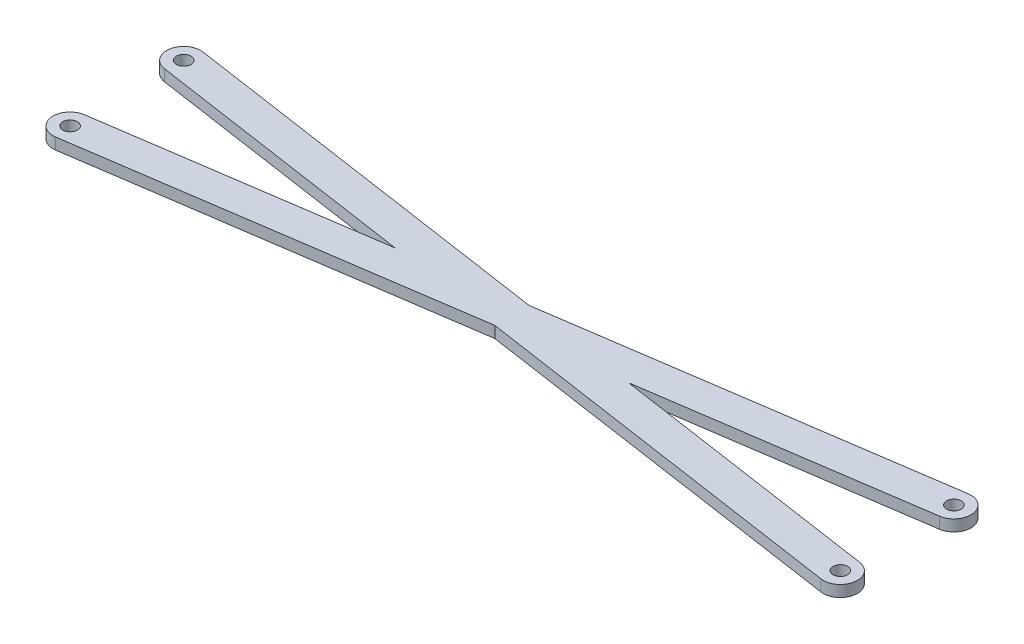
ISO-10303-21;
HEADER;
FILE_DESCRIPTION(('STEP AP214'),'2;1');
FILE_NAME('part.step','',(''),(''),'','','');
FILE_SCHEMA(('AUTOMOTIVE_DESIGN { 1 0 10303 214 1 1 1 1 }'));
ENDSEC;
DATA;
#1=APPLICATION_CONTEXT('core data for automotive mechanical design processes');
#2=APPLICATION_PROTOCOL_DEFINITION('international standard','automotive_design',2000,#1);
#3=PRODUCT_CONTEXT('',#1,'mechanical');
#4=PRODUCT('Part','Part','',(#3));
#5=PRODUCT_RELATED_PRODUCT_CATEGORY('part','',(#4));
#6=PRODUCT_DEFINITION_FORMATION('','',#4);
#7=PRODUCT_DEFINITION_CONTEXT('part definition',#1,'design');
#8=PRODUCT_DEFINITION('design','',#6,#7);
#9=PRODUCT_DEFINITION_SHAPE('','',#8);
#10=(LENGTH_UNIT() NAMED_UNIT(*) SI_UNIT(.MILLI.,.METRE.));
#11=(NAMED_UNIT(*) PLANE_ANGLE_UNIT() SI_UNIT($,.RADIAN.));
#12=(NAMED_UNIT(*) SI_UNIT($,.STERADIAN.) SOLID_ANGLE_UNIT());
#13=UNCERTAINTY_MEASURE_WITH_UNIT(LENGTH_MEASURE(1.E-05),#10,'distance_accuracy_value','');
#14=(GEOMETRIC_REPRESENTATION_CONTEXT(3) GLOBAL_UNCERTAINTY_ASSIGNED_CONTEXT((#13)) GLOBAL_UNIT_ASSIGNED_CONTEXT((#10,
#11,#12)) REPRESENTATION_CONTEXT('',''));
#15=CARTESIAN_POINT('',(0.,0.,0.));
#16=DIRECTION('',(0.,0.,1.));
#17=DIRECTION('',(1.,0.,0.));
#18=AXIS2_PLACEMENT_3D('',#15,#16,#17);
#19=CARTESIAN_POINT('',(-107.477140515228,3.175,17.084763592056));
#20=DIRECTION('',(0.,-1.,0.));
#21=DIRECTION('',(0.,0.,-1.));
#22=AXIS2_PLACEMENT_3D('',#19,#20,#21);
#23=CYLINDRICAL_SURFACE('',#22,4.7625);
#24=CARTESIAN_POINT('',(-107.477140515228,0.,17.084763592056));
#25=DIRECTION('',(0.,1.,0.));
#26=DIRECTION('',(0.,0.,1.));
#27=AXIS2_PLACEMENT_3D('',#24,#25,#26);
#28=CIRCLE('',#27,4.7625);
#29=CARTESIAN_POINT('',(-108.172056186465,0.,12.3732353410669));
#30=VERTEX_POINT('',#29);
#31=CARTESIAN_POINT('',(-106.782225063669,0.,21.7962918754461));
#32=VERTEX_POINT('',#31);
#33=EDGE_CURVE('E178',#30,#32,#28,.T.);
#34=ORIENTED_EDGE('',*,*,#33,.T.);
#35=DIRECTION('',(0.,-1.,0.));
#36=VECTOR('',#35,1.);
#37=CARTESIAN_POINT('',(-106.782225063669,3.175,21.7962918754461));
#38=LINE('',#37,#36);
#39=CARTESIAN_POINT('',(-106.782225063669,3.175,21.7962918754461));
#40=VERTEX_POINT('',#39);
#41=EDGE_CURVE('E11',#40,#32,#38,.T.);
#42=ORIENTED_EDGE('',*,*,#41,.F.);
#43=CARTESIAN_POINT('',(-107.477140515228,3.175,17.084763592056));
#44=DIRECTION('',(0.,1.,0.));
#45=DIRECTION('',(0.,0.,1.));
#46=AXIS2_PLACEMENT_3D('',#43,#44,#45);
#47=CIRCLE('',#46,4.7625);
#48=CARTESIAN_POINT('',(-108.172056186465,3.175,12.3732353410669));
#49=VERTEX_POINT('',#48);
#50=EDGE_CURVE('E213',#49,#40,#47,.T.);
#51=ORIENTED_EDGE('',*,*,#50,.F.);
#52=DIRECTION('',(0.,-1.,0.));
#53=VECTOR('',#52,1.);
#54=CARTESIAN_POINT('',(-108.172056186465,3.175,12.3732353410669));
#55=LINE('',#54,#53);
#56=EDGE_CURVE('E174',#49,#30,#55,.T.);
#57=ORIENTED_EDGE('',*,*,#56,.T.);
#58=EDGE_LOOP('',(#34,#42,#51,#57));
#59=FACE_BOUND('',#58,.T.);
#60=ADVANCED_FACE('F49',(#59),#23,.T.);
#61=CARTESIAN_POINT('',(-106.782225063669,3.175,21.7962918754461));
#62=DIRECTION('',(-0.145914051703377,0.,-0.9892972705489));
#63=DIRECTION('',(-0.9892972705489,0.,0.145914051703378));
#64=AXIS2_PLACEMENT_3D('',#61,#62,#63);
#65=PLANE('',#64);
#66=DIRECTION('',(0.9892972705489,0.,-0.145914051703377));
#67=VECTOR('',#66,1.);
#68=CARTESIAN_POINT('',(-106.782225063669,0.,21.7962918754461));
#69=LINE('',#68,#67);
#70=CARTESIAN_POINT('',(0.155358317603304,0.,6.02378695195464));
#71=VERTEX_POINT('',#70);
#72=EDGE_CURVE('E182',#32,#71,#69,.T.);
#73=ORIENTED_EDGE('',*,*,#72,.T.);
#74=DIRECTION('',(0.,-1.,0.));
#75=VECTOR('',#74,1.);
#76=CARTESIAN_POINT('',(0.155358317603304,3.175,6.02378695195464));
#77=LINE('',#76,#75);
#78=CARTESIAN_POINT('',(0.155358317603304,3.175,6.02378695195464));
#79=VERTEX_POINT('',#78);
#80=EDGE_CURVE('E58',#79,#71,#77,.T.);
#81=ORIENTED_EDGE('',*,*,#80,.F.);
#82=DIRECTION('',(0.9892972705489,0.,-0.145914051703377));
#83=VECTOR('',#82,1.);
#84=CARTESIAN_POINT('',(-106.782225063669,3.175,21.7962918754461));
#85=LINE('',#84,#83);
#86=EDGE_CURVE('E123',#40,#79,#85,.T.);
#87=ORIENTED_EDGE('',*,*,#86,.F.);
#88=ORIENTED_EDGE('',*,*,#41,.T.);
#89=EDGE_LOOP('',(#73,#81,#87,#88));
#90=FACE_BOUND('',#89,.T.);
#91=ADVANCED_FACE('F309',(#90),#65,.F.);
#92=CARTESIAN_POINT('',(0.155358317603304,3.175,6.02378695195464));
#93=DIRECTION('',(0.145914048586038,0.,-0.989297271008685));
#94=DIRECTION('',(-0.989297271008685,0.,-0.145914048586038));
#95=AXIS2_PLACEMENT_3D('',#92,#93,#94);
#96=PLANE('',#95);
#97=DIRECTION('',(0.989297271008685,0.,0.145914048586038));
#98=VECTOR('',#97,1.);
#99=CARTESIAN_POINT('',(0.155358317603304,0.,6.02378695195464));
#100=LINE('',#99,#98);
#101=CARTESIAN_POINT('',(107.092941748575,0.,21.7962915384787));
#102=VERTEX_POINT('',#101);
#103=EDGE_CURVE('E186',#71,#102,#100,.T.);
#104=ORIENTED_EDGE('',*,*,#103,.T.);
#105=DIRECTION('',(0.,-1.,0.));
#106=VECTOR('',#105,1.);
#107=CARTESIAN_POINT('',(107.092941748575,3.175,21.7962915384787));
#108=LINE('',#107,#106);
#109=CARTESIAN_POINT('',(107.092941748575,3.175,21.7962915384787));
#110=VERTEX_POINT('',#109);
#111=EDGE_CURVE('E240',#110,#102,#108,.T.);
#112=ORIENTED_EDGE('',*,*,#111,.F.);
#113=DIRECTION('',(0.989297271008685,0.,0.145914048586038));
#114=VECTOR('',#113,1.);
#115=CARTESIAN_POINT('',(0.155358317603304,3.175,6.02378695195464));
#116=LINE('',#115,#114);
#117=EDGE_CURVE('E250',#79,#110,#116,.T.);
#118=ORIENTED_EDGE('',*,*,#117,.F.);
#119=ORIENTED_EDGE('',*,*,#80,.T.);
#120=EDGE_LOOP('',(#104,#112,#118,#119));
#121=FACE_BOUND('',#120,.T.);
#122=ADVANCED_FACE('F248',(#121),#96,.F.);
#123=CARTESIAN_POINT('',(107.787859484772,3.175,17.084763592056));
#124=DIRECTION('',(0.,-1.,0.));
#125=DIRECTION('',(0.,0.,-1.));
#126=AXIS2_PLACEMENT_3D('',#123,#124,#125);
#127=CYLINDRICAL_SURFACE('',#126,4.76250000000023);
#128=CARTESIAN_POINT('',(107.787859484772,0.,17.084763592056));
#129=DIRECTION('',(0.,1.,0.));
#130=DIRECTION('',(0.,0.,1.));
#131=AXIS2_PLACEMENT_3D('',#128,#129,#130);
#132=CIRCLE('',#131,4.76250000000023);
#133=CARTESIAN_POINT('',(108.482775141163,0.,12.3732353388771));
#134=VERTEX_POINT('',#133);
#135=EDGE_CURVE('E189',#102,#134,#132,.T.);
#136=ORIENTED_EDGE('',*,*,#135,.T.);
#137=DIRECTION('',(0.,-1.,0.));
#138=VECTOR('',#137,1.);
#139=CARTESIAN_POINT('',(108.482775141163,3.175,12.3732353388771));
#140=LINE('',#139,#138);
#141=CARTESIAN_POINT('',(108.482775141163,3.175,12.3732353388771));
#142=VERTEX_POINT('',#141);
#143=EDGE_CURVE('E236',#142,#134,#140,.T.);
#144=ORIENTED_EDGE('',*,*,#143,.F.);
#145=CARTESIAN_POINT('',(107.787859484772,3.175,17.084763592056));
#146=DIRECTION('',(0.,1.,0.));
#147=DIRECTION('',(0.,0.,1.));
#148=AXIS2_PLACEMENT_3D('',#145,#146,#147);
#149=CIRCLE('',#148,4.76250000000023);
#150=EDGE_CURVE('E269',#110,#142,#149,.T.);
#151=ORIENTED_EDGE('',*,*,#150,.F.);
#152=ORIENTED_EDGE('',*,*,#111,.T.);
#153=EDGE_LOOP('',(#136,#144,#151,#152));
#154=FACE_BOUND('',#153,.T.);
#155=ADVANCED_FACE('F259',(#154),#127,.T.);
#156=CARTESIAN_POINT('',(32.7944358716165,3.175,1.2097637138996));
#157=DIRECTION('',(-0.145914048586038,0.,0.989297271008685));
#158=DIRECTION('',(0.989297271008685,0.,0.145914048586038));
#159=AXIS2_PLACEMENT_3D('',#156,#157,#158);
#160=PLANE('',#159);
#161=DIRECTION('',(-0.989297271008685,0.,-0.145914048586038));
#162=VECTOR('',#161,1.);
#163=CARTESIAN_POINT('',(32.7944358716165,0.,1.2097637138996));
#164=LINE('',#163,#162);
#165=CARTESIAN_POINT('',(32.7944358716165,0.,1.2097637138996));
#166=VERTEX_POINT('',#165);
#167=EDGE_CURVE('E192',#134,#166,#164,.T.);
#168=ORIENTED_EDGE('',*,*,#167,.T.);
#169=DIRECTION('',(0.,-1.,0.));
#170=VECTOR('',#169,1.);
#171=CARTESIAN_POINT('',(32.7944358716165,3.175,1.2097637138996));
#172=LINE('',#171,#170);
#173=CARTESIAN_POINT('',(32.7944358716165,3.175,1.2097637138996));
#174=VERTEX_POINT('',#173);
#175=EDGE_CURVE('E232',#174,#166,#172,.T.);
#176=ORIENTED_EDGE('',*,*,#175,.F.);
#177=DIRECTION('',(-0.989297271008685,0.,-0.145914048586038));
#178=VECTOR('',#177,1.);
#179=CARTESIAN_POINT('',(32.7944358716165,3.175,1.2097637138996));
#180=LINE('',#179,#178);
#181=EDGE_CURVE('E265',#142,#174,#180,.T.);
#182=ORIENTED_EDGE('',*,*,#181,.F.);
#183=ORIENTED_EDGE('',*,*,#143,.T.);
#184=EDGE_LOOP('',(#168,#176,#182,#183));
#185=FACE_BOUND('',#184,.T.);
#186=ADVANCED_FACE('F263',(#185),#160,.F.);
#187=CARTESIAN_POINT('',(32.7944358716165,3.175,1.2097637138996));
#188=DIRECTION('',(-0.145914051703378,0.,-0.9892972705489));
#189=DIRECTION('',(-0.9892972705489,0.,0.145914051703378));
#190=AXIS2_PLACEMENT_3D('',#187,#188,#189);
#191=PLANE('',#190);
#192=DIRECTION('',(0.9892972705489,0.,-0.145914051703378));
#193=VECTOR('',#192,1.);
#194=CARTESIAN_POINT('',(32.7944358716165,0.,1.2097637138996));
#195=LINE('',#194,#193);
#196=CARTESIAN_POINT('',(108.482775156009,0.,-9.95370815695461));
#197=VERTEX_POINT('',#196);
#198=EDGE_CURVE('E195',#166,#197,#195,.T.);
#199=ORIENTED_EDGE('',*,*,#198,.T.);
#200=DIRECTION('',(0.,-1.,0.));
#201=VECTOR('',#200,1.);
#202=CARTESIAN_POINT('',(108.482775156009,3.175,-9.95370815695461));
#203=LINE('',#202,#201);
#204=CARTESIAN_POINT('',(108.482775156009,3.175,-9.95370815695461));
#205=VERTEX_POINT('',#204);
#206=EDGE_CURVE('E228',#205,#197,#203,.T.);
#207=ORIENTED_EDGE('',*,*,#206,.F.);
#208=DIRECTION('',(0.9892972705489,0.,-0.145914051703378));
#209=VECTOR('',#208,1.);
#210=CARTESIAN_POINT('',(32.7944358716165,3.175,1.2097637138996));
#211=LINE('',#210,#209);
#212=EDGE_CURVE('E268',#174,#205,#211,.T.);
#213=ORIENTED_EDGE('',*,*,#212,.F.);
#214=ORIENTED_EDGE('',*,*,#175,.T.);
#215=EDGE_LOOP('',(#199,#207,#213,#214));
#216=FACE_BOUND('',#215,.T.);
#217=ADVANCED_FACE('F322',(#216),#191,.F.);
#218=CARTESIAN_POINT('',(107.787859484772,3.175,-14.665236407944));
#219=DIRECTION('',(0.,-1.,0.));
#220=DIRECTION('',(0.,0.,-1.));
#221=AXIS2_PLACEMENT_3D('',#218,#219,#220);
#222=CYLINDRICAL_SURFACE('',#221,4.76250000000024);
#223=CARTESIAN_POINT('',(107.787859484772,0.,-14.665236407944));
#224=DIRECTION('',(0.,1.,0.));
#225=DIRECTION('',(0.,0.,1.));
#226=AXIS2_PLACEMENT_3D('',#223,#224,#225);
#227=CIRCLE('',#226,4.76250000000024);
#228=CARTESIAN_POINT('',(107.092941683706,0.,-19.376764344799));
#229=VERTEX_POINT('',#228);
#230=EDGE_CURVE('E198',#197,#229,#227,.T.);
#231=ORIENTED_EDGE('',*,*,#230,.T.);
#232=DIRECTION('',(0.,-1.,0.));
#233=VECTOR('',#232,1.);
#234=CARTESIAN_POINT('',(107.092941683706,3.175,-19.376764344799));
#235=LINE('',#234,#233);
#236=CARTESIAN_POINT('',(107.092941683706,3.175,-19.376764344799));
#237=VERTEX_POINT('',#236);
#238=EDGE_CURVE('E224',#237,#229,#235,.T.);
#239=ORIENTED_EDGE('',*,*,#238,.F.);
#240=CARTESIAN_POINT('',(107.787859484772,3.175,-14.665236407944));
#241=DIRECTION('',(0.,1.,0.));
#242=DIRECTION('',(0.,0.,1.));
#243=AXIS2_PLACEMENT_3D('',#240,#241,#242);
#244=CIRCLE('',#243,4.76250000000024);
#245=EDGE_CURVE('E273',#205,#237,#244,.T.);
#246=ORIENTED_EDGE('',*,*,#245,.F.);
#247=ORIENTED_EDGE('',*,*,#206,.T.);
#248=EDGE_LOOP('',(#231,#239,#246,#247));
#249=FACE_BOUND('',#248,.T.);
#250=ADVANCED_FACE('F325',(#249),#222,.T.);
#251=CARTESIAN_POINT('',(0.155358302434037,3.175,-3.60425942130762));
#252=DIRECTION('',(0.145914051703378,0.,0.9892972705489));
#253=DIRECTION('',(0.9892972705489,0.,-0.145914051703378));
#254=AXIS2_PLACEMENT_3D('',#251,#252,#253);
#255=PLANE('',#254);
#256=DIRECTION('',(-0.9892972705489,0.,0.145914051703378));
#257=VECTOR('',#256,1.);
#258=CARTESIAN_POINT('',(0.155358302434037,0.,-3.60425942130762));
#259=LINE('',#258,#257);
#260=CARTESIAN_POINT('',(0.155358302434037,0.,-3.60425942130762));
#261=VERTEX_POINT('',#260);
#262=EDGE_CURVE('E201',#229,#261,#259,.T.);
#263=ORIENTED_EDGE('',*,*,#262,.T.);
#264=DIRECTION('',(0.,-1.,0.));
#265=VECTOR('',#264,1.);
#266=CARTESIAN_POINT('',(0.155358302434037,3.175,-3.60425942130762));
#267=LINE('',#266,#265);
#268=CARTESIAN_POINT('',(0.155358302434037,3.175,-3.60425942130762));
#269=VERTEX_POINT('',#268);
#270=EDGE_CURVE('E220',#269,#261,#267,.T.);
#271=ORIENTED_EDGE('',*,*,#270,.F.);
#272=DIRECTION('',(-0.9892972705489,0.,0.145914051703378));
#273=VECTOR('',#272,1.);
#274=CARTESIAN_POINT('',(0.155358302434037,3.175,-3.60425942130762));
#275=LINE('',#274,#273);
#276=EDGE_CURVE('E280',#237,#269,#275,.T.);
#277=ORIENTED_EDGE('',*,*,#276,.F.);
#278=ORIENTED_EDGE('',*,*,#238,.T.);
#279=EDGE_LOOP('',(#263,#271,#277,#278));
#280=FACE_BOUND('',#279,.T.);
#281=ADVANCED_FACE('F288',(#280),#255,.F.);
#282=CARTESIAN_POINT('',(-106.782225128538,3.175,-19.3767640078318));
#283=DIRECTION('',(-0.145914048586038,0.,0.989297271008685));
#284=DIRECTION('',(0.989297271008685,0.,0.145914048586038));
#285=AXIS2_PLACEMENT_3D('',#282,#283,#284);
#286=PLANE('',#285);
#287=DIRECTION('',(-0.989297271008685,0.,-0.145914048586038));
#288=VECTOR('',#287,1.);
#289=CARTESIAN_POINT('',(-106.782225128538,0.,-19.3767640078318));
#290=LINE('',#289,#288);
#291=CARTESIAN_POINT('',(-106.782225128538,0.,-19.3767640078318));
#292=VERTEX_POINT('',#291);
#293=EDGE_CURVE('E204',#261,#292,#290,.T.);
#294=ORIENTED_EDGE('',*,*,#293,.T.);
#295=DIRECTION('',(0.,-1.,0.));
#296=VECTOR('',#295,1.);
#297=CARTESIAN_POINT('',(-106.782225128538,3.175,-19.3767640078318));
#298=LINE('',#297,#296);
#299=CARTESIAN_POINT('',(-106.782225128538,3.175,-19.3767640078318));
#300=VERTEX_POINT('',#299);
#301=EDGE_CURVE('E167',#300,#292,#298,.T.);
#302=ORIENTED_EDGE('',*,*,#301,.F.);
#303=DIRECTION('',(-0.989297271008685,0.,-0.145914048586038));
#304=VECTOR('',#303,1.);
#305=CARTESIAN_POINT('',(-106.782225128538,3.175,-19.3767640078318));
#306=LINE('',#305,#304);
#307=EDGE_CURVE('E156',#269,#300,#306,.T.);
#308=ORIENTED_EDGE('',*,*,#307,.F.);
#309=ORIENTED_EDGE('',*,*,#270,.T.);
#310=EDGE_LOOP('',(#294,#302,#308,#309));
#311=FACE_BOUND('',#310,.T.);
#312=ADVANCED_FACE('F292',(#311),#286,.F.);
#313=CARTESIAN_POINT('',(-107.477140515228,3.175,-14.665235714874));
#314=DIRECTION('',(0.,-1.,0.));
#315=DIRECTION('',(0.,0.,-1.));
#316=AXIS2_PLACEMENT_3D('',#313,#314,#315);
#317=CYLINDRICAL_SURFACE('',#316,4.76250000000001);
#318=CARTESIAN_POINT('',(-107.477140515228,0.,-14.665235714874));
#319=DIRECTION('',(0.,1.,0.));
#320=DIRECTION('',(0.,0.,1.));
#321=AXIS2_PLACEMENT_3D('',#318,#319,#320);
#322=CIRCLE('',#321,4.76250000000001);
#323=CARTESIAN_POINT('',(-108.172056171619,0.,-9.95370746169517));
#324=VERTEX_POINT('',#323);
#325=EDGE_CURVE('E165',#292,#324,#322,.T.);
#326=ORIENTED_EDGE('',*,*,#325,.T.);
#327=DIRECTION('',(0.,-1.,0.));
#328=VECTOR('',#327,1.);
#329=CARTESIAN_POINT('',(-108.172056171619,3.175,-9.95370746169517));
#330=LINE('',#329,#328);
#331=CARTESIAN_POINT('',(-108.172056171619,3.175,-9.95370746169517));
#332=VERTEX_POINT('',#331);
#333=EDGE_CURVE('E162',#332,#324,#330,.T.);
#334=ORIENTED_EDGE('',*,*,#333,.F.);
#335=CARTESIAN_POINT('',(-107.477140515228,3.175,-14.665235714874));
#336=DIRECTION('',(0.,1.,0.));
#337=DIRECTION('',(0.,0.,1.));
#338=AXIS2_PLACEMENT_3D('',#335,#336,#337);
#339=CIRCLE('',#338,4.76250000000001);
#340=EDGE_CURVE('E150',#300,#332,#339,.T.);
#341=ORIENTED_EDGE('',*,*,#340,.F.);
#342=ORIENTED_EDGE('',*,*,#301,.T.);
#343=EDGE_LOOP('',(#326,#334,#341,#342));
#344=FACE_BOUND('',#343,.T.);
#345=ADVANCED_FACE('F163',(#344),#317,.T.);
#346=CARTESIAN_POINT('',(-108.172056171619,3.175,-9.95370746169517));
#347=DIRECTION('',(0.145914048586038,0.,-0.989297271008685));
#348=DIRECTION('',(-0.989297271008685,0.,-0.145914048586038));
#349=AXIS2_PLACEMENT_3D('',#346,#347,#348);
#350=PLANE('',#349);
#351=DIRECTION('',(0.989297271008685,0.,0.145914048586038));
#352=VECTOR('',#351,1.);
#353=CARTESIAN_POINT('',(-108.172056171619,0.,-9.95370746169517));
#354=LINE('',#353,#352);
#355=CARTESIAN_POINT('',(-32.4837192515792,0.,1.20976381674743));
#356=VERTEX_POINT('',#355);
#357=EDGE_CURVE('E109',#324,#356,#354,.T.);
#358=ORIENTED_EDGE('',*,*,#357,.T.);
#359=DIRECTION('',(0.,-1.,0.));
#360=VECTOR('',#359,1.);
#361=CARTESIAN_POINT('',(-32.4837192515792,3.175,1.20976381674743));
#362=LINE('',#361,#360);
#363=CARTESIAN_POINT('',(-32.4837192515792,3.175,1.20976381674743));
#364=VERTEX_POINT('',#363);
#365=EDGE_CURVE('E168',#364,#356,#362,.T.);
#366=ORIENTED_EDGE('',*,*,#365,.F.);
#367=DIRECTION('',(0.989297271008685,0.,0.145914048586038));
#368=VECTOR('',#367,1.);
#369=CARTESIAN_POINT('',(-108.172056171619,3.175,-9.95370746169517));
#370=LINE('',#369,#368);
#371=EDGE_CURVE('E154',#332,#364,#370,.T.);
#372=ORIENTED_EDGE('',*,*,#371,.F.);
#373=ORIENTED_EDGE('',*,*,#333,.T.);
#374=EDGE_LOOP('',(#358,#366,#372,#373));
#375=FACE_BOUND('',#374,.T.);
#376=ADVANCED_FACE('F170',(#375),#350,.F.);
#377=CARTESIAN_POINT('',(-108.172056186465,3.175,12.3732353410669));
#378=DIRECTION('',(0.145914051703378,0.,0.9892972705489));
#379=DIRECTION('',(0.9892972705489,0.,-0.145914051703378));
#380=AXIS2_PLACEMENT_3D('',#377,#378,#379);
#381=PLANE('',#380);
#382=DIRECTION('',(-0.9892972705489,0.,0.145914051703378));
#383=VECTOR('',#382,1.);
#384=CARTESIAN_POINT('',(-108.172056186465,0.,12.3732353410669));
#385=LINE('',#384,#383);
#386=EDGE_CURVE('E115',#356,#30,#385,.T.);
#387=ORIENTED_EDGE('',*,*,#386,.T.);
#388=ORIENTED_EDGE('',*,*,#56,.F.);
#389=DIRECTION('',(-0.9892972705489,0.,0.145914051703378));
#390=VECTOR('',#389,1.);
#391=CARTESIAN_POINT('',(-108.172056186465,3.175,12.3732353410669));
#392=LINE('',#391,#390);
#393=EDGE_CURVE('E66',#364,#49,#392,.T.);
#394=ORIENTED_EDGE('',*,*,#393,.F.);
#395=ORIENTED_EDGE('',*,*,#365,.T.);
#396=EDGE_LOOP('',(#387,#388,#394,#395));
#397=FACE_BOUND('',#396,.T.);
#398=ADVANCED_FACE('F296',(#397),#381,.F.);
#399=CARTESIAN_POINT('',(-107.477140515228,3.175,17.084763592056));
#400=DIRECTION('',(0.,1.,0.));
#401=DIRECTION('',(0.,0.,1.));
#402=AXIS2_PLACEMENT_3D('',#399,#400,#401);
#403=PLANE('',#402);
#404=CARTESIAN_POINT('',(-107.477140515228,3.175,17.084763592056));
#405=DIRECTION('',(0.,1.,0.));
#406=DIRECTION('',(0.,0.,1.));
#407=AXIS2_PLACEMENT_3D('',#404,#405,#406);
#408=CIRCLE('',#407,2.03200000000001);
#409=CARTESIAN_POINT('',(-107.477140515228,3.175,19.116763592056));
#410=VERTEX_POINT('',#409);
#411=EDGE_CURVE('E413',#410,#410,#408,.T.);
#412=ORIENTED_EDGE('',*,*,#411,.F.);
#413=EDGE_LOOP('',(#412));
#414=FACE_BOUND('',#413,.T.);
#415=CARTESIAN_POINT('',(107.787859484772,3.175,-14.665236407944));
#416=DIRECTION('',(0.,1.,0.));
#417=DIRECTION('',(0.,0.,1.));
#418=AXIS2_PLACEMENT_3D('',#415,#416,#417);
#419=CIRCLE('',#418,2.03200000000001);
#420=CARTESIAN_POINT('',(107.787859484772,3.175,-12.633236407944));
#421=VERTEX_POINT('',#420);
#422=EDGE_CURVE('E421',#421,#421,#419,.T.);
#423=ORIENTED_EDGE('',*,*,#422,.F.);
#424=EDGE_LOOP('',(#423));
#425=FACE_BOUND('',#424,.T.);
#426=CARTESIAN_POINT('',(107.787859484772,3.175,17.084763592056));
#427=DIRECTION('',(0.,1.,0.));
#428=DIRECTION('',(0.,0.,1.));
#429=AXIS2_PLACEMENT_3D('',#426,#427,#428);
#430=CIRCLE('',#429,2.03200000000001);
#431=CARTESIAN_POINT('',(107.787859484772,3.175,19.116763592056));
#432=VERTEX_POINT('',#431);
#433=EDGE_CURVE('E434',#432,#432,#430,.T.);
#434=ORIENTED_EDGE('',*,*,#433,.F.);
#435=EDGE_LOOP('',(#434));
#436=FACE_BOUND('',#435,.T.);
#437=CARTESIAN_POINT('',(-107.477140515228,3.175,-14.665235714874));
#438=DIRECTION('',(0.,1.,0.));
#439=DIRECTION('',(0.,0.,1.));
#440=AXIS2_PLACEMENT_3D('',#437,#438,#439);
#441=CIRCLE('',#440,2.03200000000001);
#442=CARTESIAN_POINT('',(-107.477140515228,3.175,-12.633235714874));
#443=VERTEX_POINT('',#442);
#444=EDGE_CURVE('E415',#443,#443,#441,.T.);
#445=ORIENTED_EDGE('',*,*,#444,.F.);
#446=EDGE_LOOP('',(#445));
#447=FACE_BOUND('',#446,.T.);
#448=ORIENTED_EDGE('',*,*,#50,.T.);
#449=ORIENTED_EDGE('',*,*,#86,.T.);
#450=ORIENTED_EDGE('',*,*,#117,.T.);
#451=ORIENTED_EDGE('',*,*,#150,.T.);
#452=ORIENTED_EDGE('',*,*,#181,.T.);
#453=ORIENTED_EDGE('',*,*,#212,.T.);
#454=ORIENTED_EDGE('',*,*,#245,.T.);
#455=ORIENTED_EDGE('',*,*,#276,.T.);
#456=ORIENTED_EDGE('',*,*,#307,.T.);
#457=ORIENTED_EDGE('',*,*,#340,.T.);
#458=ORIENTED_EDGE('',*,*,#371,.T.);
#459=ORIENTED_EDGE('',*,*,#393,.T.);
#460=EDGE_LOOP('',(#448,#449,#450,#451,#452,#453,#454,#455,#456,#457,#458,#459));
#461=FACE_BOUND('',#460,.T.);
#462=ADVANCED_FACE('F152',(#414,#425,#436,#447,#461),#403,.T.);
#463=CARTESIAN_POINT('',(-107.477140515228,0.,17.084763592056));
#464=DIRECTION('',(0.,1.,0.));
#465=DIRECTION('',(0.,0.,1.));
#466=AXIS2_PLACEMENT_3D('',#463,#464,#465);
#467=PLANE('',#466);
#468=CARTESIAN_POINT('',(-107.477140515228,0.,17.084763592056));
#469=DIRECTION('',(0.,1.,0.));
#470=DIRECTION('',(0.,0.,1.));
#471=AXIS2_PLACEMENT_3D('',#468,#469,#470);
#472=CIRCLE('',#471,2.03200000000001);
#473=CARTESIAN_POINT('',(-107.477140515228,0.,19.116763592056));
#474=VERTEX_POINT('',#473);
#475=EDGE_CURVE('E410',#474,#474,#472,.T.);
#476=ORIENTED_EDGE('',*,*,#475,.T.);
#477=EDGE_LOOP('',(#476));
#478=FACE_BOUND('',#477,.T.);
#479=CARTESIAN_POINT('',(107.787859484772,0.,-14.665236407944));
#480=DIRECTION('',(0.,1.,0.));
#481=DIRECTION('',(0.,0.,1.));
#482=AXIS2_PLACEMENT_3D('',#479,#480,#481);
#483=CIRCLE('',#482,2.03200000000001);
#484=CARTESIAN_POINT('',(107.787859484772,0.,-12.633236407944));
#485=VERTEX_POINT('',#484);
#486=EDGE_CURVE('E430',#485,#485,#483,.T.);
#487=ORIENTED_EDGE('',*,*,#486,.T.);
#488=EDGE_LOOP('',(#487));
#489=FACE_BOUND('',#488,.T.);
#490=CARTESIAN_POINT('',(107.787859484772,0.,17.084763592056));
#491=DIRECTION('',(0.,1.,0.));
#492=DIRECTION('',(0.,0.,1.));
#493=AXIS2_PLACEMENT_3D('',#490,#491,#492);
#494=CIRCLE('',#493,2.03200000000001);
#495=CARTESIAN_POINT('',(107.787859484772,0.,19.116763592056));
#496=VERTEX_POINT('',#495);
#497=EDGE_CURVE('E424',#496,#496,#494,.T.);
#498=ORIENTED_EDGE('',*,*,#497,.T.);
#499=EDGE_LOOP('',(#498));
#500=FACE_BOUND('',#499,.T.);
#501=CARTESIAN_POINT('',(-107.477140515228,0.,-14.665235714874));
#502=DIRECTION('',(0.,1.,0.));
#503=DIRECTION('',(0.,0.,1.));
#504=AXIS2_PLACEMENT_3D('',#501,#502,#503);
#505=CIRCLE('',#504,2.03200000000001);
#506=CARTESIAN_POINT('',(-107.477140515228,0.,-12.633235714874));
#507=VERTEX_POINT('',#506);
#508=EDGE_CURVE('E183',#507,#507,#505,.T.);
#509=ORIENTED_EDGE('',*,*,#508,.T.);
#510=EDGE_LOOP('',(#509));
#511=FACE_BOUND('',#510,.T.);
#512=ORIENTED_EDGE('',*,*,#33,.F.);
#513=ORIENTED_EDGE('',*,*,#386,.F.);
#514=ORIENTED_EDGE('',*,*,#357,.F.);
#515=ORIENTED_EDGE('',*,*,#325,.F.);
#516=ORIENTED_EDGE('',*,*,#293,.F.);
#517=ORIENTED_EDGE('',*,*,#262,.F.);
#518=ORIENTED_EDGE('',*,*,#230,.F.);
#519=ORIENTED_EDGE('',*,*,#198,.F.);
#520=ORIENTED_EDGE('',*,*,#167,.F.);
#521=ORIENTED_EDGE('',*,*,#135,.F.);
#522=ORIENTED_EDGE('',*,*,#103,.F.);
#523=ORIENTED_EDGE('',*,*,#72,.F.);
#524=EDGE_LOOP('',(#512,#513,#514,#515,#516,#517,#518,#519,#520,#521,#522,#523));
#525=FACE_BOUND('',#524,.T.);
#526=ADVANCED_FACE('F254',(#478,#489,#500,#511,#525),#467,.F.);
#527=CARTESIAN_POINT('',(-107.477140515228,0.,-14.665235714874));
#528=DIRECTION('',(0.,1.,0.));
#529=DIRECTION('',(0.,0.,1.));
#530=AXIS2_PLACEMENT_3D('',#527,#528,#529);
#531=CYLINDRICAL_SURFACE('',#530,2.03200000000001);
#532=ORIENTED_EDGE('',*,*,#508,.F.);
#533=EDGE_LOOP('',(#532));
#534=FACE_BOUND('',#533,.T.);
#535=ORIENTED_EDGE('',*,*,#444,.T.);
#536=EDGE_LOOP('',(#535));
#537=FACE_BOUND('',#536,.T.);
#538=ADVANCED_FACE('F365',(#534,#537),#531,.F.);
#539=CARTESIAN_POINT('',(107.787859484772,0.,17.084763592056));
#540=DIRECTION('',(0.,1.,0.));
#541=DIRECTION('',(0.,0.,1.));
#542=AXIS2_PLACEMENT_3D('',#539,#540,#541);
#543=CYLINDRICAL_SURFACE('',#542,2.03200000000001);
#544=ORIENTED_EDGE('',*,*,#497,.F.);
#545=EDGE_LOOP('',(#544));
#546=FACE_BOUND('',#545,.T.);
#547=ORIENTED_EDGE('',*,*,#433,.T.);
#548=EDGE_LOOP('',(#547));
#549=FACE_BOUND('',#548,.T.);
#550=ADVANCED_FACE('F374',(#546,#549),#543,.F.);
#551=CARTESIAN_POINT('',(107.787859484772,0.,-14.665236407944));
#552=DIRECTION('',(0.,1.,0.));
#553=DIRECTION('',(0.,0.,1.));
#554=AXIS2_PLACEMENT_3D('',#551,#552,#553);
#555=CYLINDRICAL_SURFACE('',#554,2.03200000000001);
#556=ORIENTED_EDGE('',*,*,#486,.F.);
#557=EDGE_LOOP('',(#556));
#558=FACE_BOUND('',#557,.T.);
#559=ORIENTED_EDGE('',*,*,#422,.T.);
#560=EDGE_LOOP('',(#559));
#561=FACE_BOUND('',#560,.T.);
#562=ADVANCED_FACE('F384',(#558,#561),#555,.F.);
#563=CARTESIAN_POINT('',(-107.477140515228,0.,17.084763592056));
#564=DIRECTION('',(0.,1.,0.));
#565=DIRECTION('',(0.,0.,1.));
#566=AXIS2_PLACEMENT_3D('',#563,#564,#565);
#567=CYLINDRICAL_SURFACE('',#566,2.03200000000001);
#568=ORIENTED_EDGE('',*,*,#475,.F.);
#569=EDGE_LOOP('',(#568));
#570=FACE_BOUND('',#569,.T.);
#571=ORIENTED_EDGE('',*,*,#411,.T.);
#572=EDGE_LOOP('',(#571));
#573=FACE_BOUND('',#572,.T.);
#574=ADVANCED_FACE('F394',(#570,#573),#567,.F.);
#575=CLOSED_SHELL('',(#60,#91,#122,#155,#186,#217,#250,#281,#312,#345,#376,#398,#462,#526,#538,
#550,#562,#574));
#576=MANIFOLD_SOLID_BREP('B2',#575);
#577=ADVANCED_BREP_SHAPE_REPRESENTATION('',(#18,#576),#14);
#578=SHAPE_DEFINITION_REPRESENTATION(#9,#577);
ENDSEC;
END-ISO-10303-21;
